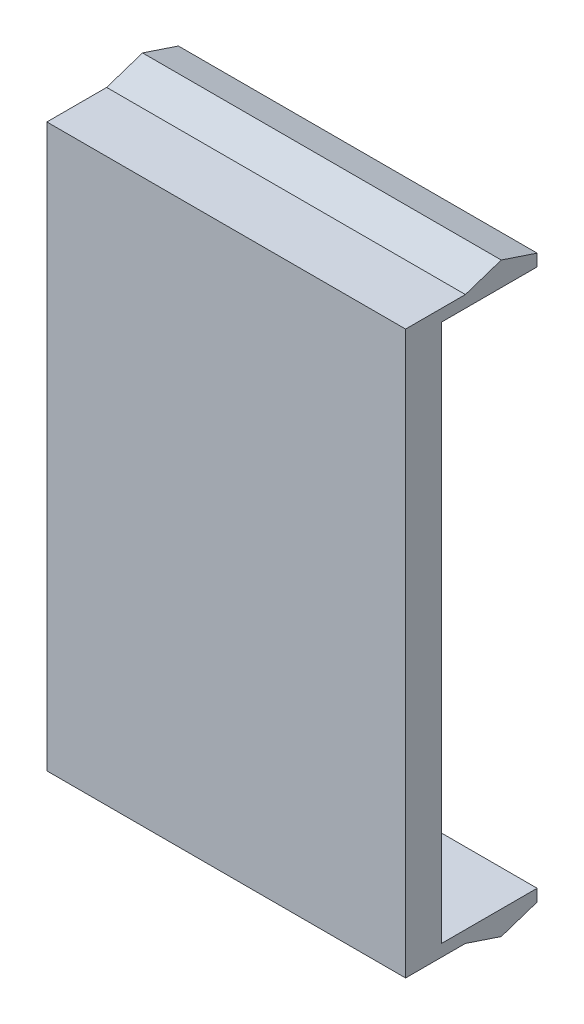
ISO-10303-21;
HEADER;
FILE_DESCRIPTION(('STEP AP214'),'2;1');
FILE_NAME('part.step','',(''),(''),'','','');
FILE_SCHEMA(('AUTOMOTIVE_DESIGN { 1 0 10303 214 1 1 1 1 }'));
ENDSEC;
DATA;
#1=APPLICATION_CONTEXT('core data for automotive mechanical design processes');
#2=APPLICATION_PROTOCOL_DEFINITION('international standard','automotive_design',2000,#1);
#3=PRODUCT_CONTEXT('',#1,'mechanical');
#4=PRODUCT('Part','Part','',(#3));
#5=PRODUCT_RELATED_PRODUCT_CATEGORY('part','',(#4));
#6=PRODUCT_DEFINITION_FORMATION('','',#4);
#7=PRODUCT_DEFINITION_CONTEXT('part definition',#1,'design');
#8=PRODUCT_DEFINITION('design','',#6,#7);
#9=PRODUCT_DEFINITION_SHAPE('','',#8);
#10=(LENGTH_UNIT() NAMED_UNIT(*) SI_UNIT(.MILLI.,.METRE.));
#11=(NAMED_UNIT(*) PLANE_ANGLE_UNIT() SI_UNIT($,.RADIAN.));
#12=(NAMED_UNIT(*) SI_UNIT($,.STERADIAN.) SOLID_ANGLE_UNIT());
#13=UNCERTAINTY_MEASURE_WITH_UNIT(LENGTH_MEASURE(1.E-05),#10,'distance_accuracy_value','');
#14=(GEOMETRIC_REPRESENTATION_CONTEXT(3) GLOBAL_UNCERTAINTY_ASSIGNED_CONTEXT((#13)) GLOBAL_UNIT_ASSIGNED_CONTEXT((#10,
#11,#12)) REPRESENTATION_CONTEXT('',''));
#15=CARTESIAN_POINT('',(0.,0.,0.));
#16=DIRECTION('',(0.,0.,1.));
#17=DIRECTION('',(1.,0.,0.));
#18=AXIS2_PLACEMENT_3D('',#15,#16,#17);
#19=CARTESIAN_POINT('',(-15.,23.5,3.));
#20=DIRECTION('',(0.,-1.,0.));
#21=DIRECTION('',(0.,0.,-1.));
#22=AXIS2_PLACEMENT_3D('',#19,#20,#21);
#23=PLANE('',#22);
#24=DIRECTION('',(1.,0.,0.));
#25=VECTOR('',#24,1.);
#26=CARTESIAN_POINT('',(-15.,23.5,-2.00000000000003));
#27=LINE('',#26,#25);
#28=CARTESIAN_POINT('',(-15.,23.5,-2.00000000000003));
#29=VERTEX_POINT('',#28);
#30=CARTESIAN_POINT('',(15.,23.5,-2.00000000000003));
#31=VERTEX_POINT('',#30);
#32=EDGE_CURVE('E70',#29,#31,#27,.T.);
#33=ORIENTED_EDGE('',*,*,#32,.F.);
#34=DIRECTION('',(0.,0.,-1.));
#35=VECTOR('',#34,1.);
#36=CARTESIAN_POINT('',(-15.,23.5,3.));
#37=LINE('',#36,#35);
#38=CARTESIAN_POINT('',(-15.,23.5,3.));
#39=VERTEX_POINT('',#38);
#40=EDGE_CURVE('E56',#39,#29,#37,.T.);
#41=ORIENTED_EDGE('',*,*,#40,.F.);
#42=DIRECTION('',(-1.,0.,0.));
#43=VECTOR('',#42,1.);
#44=CARTESIAN_POINT('',(-15.,23.5,3.));
#45=LINE('',#44,#43);
#46=CARTESIAN_POINT('',(15.,23.5,3.));
#47=VERTEX_POINT('',#46);
#48=EDGE_CURVE('E208',#47,#39,#45,.T.);
#49=ORIENTED_EDGE('',*,*,#48,.F.);
#50=DIRECTION('',(0.,0.,-1.));
#51=VECTOR('',#50,1.);
#52=CARTESIAN_POINT('',(15.,23.5,3.));
#53=LINE('',#52,#51);
#54=EDGE_CURVE('E11',#47,#31,#53,.T.);
#55=ORIENTED_EDGE('',*,*,#54,.T.);
#56=EDGE_LOOP('',(#33,#41,#49,#55));
#57=FACE_BOUND('',#56,.T.);
#58=ADVANCED_FACE('F47',(#57),#23,.F.);
#59=CARTESIAN_POINT('',(15.,-23.5,3.));
#60=DIRECTION('',(-1.,0.,0.));
#61=DIRECTION('',(0.,0.,1.));
#62=AXIS2_PLACEMENT_3D('',#59,#60,#61);
#63=PLANE('',#62);
#64=DIRECTION('',(0.,0.,-1.));
#65=VECTOR('',#64,1.);
#66=CARTESIAN_POINT('',(15.,-23.5,3.));
#67=LINE('',#66,#65);
#68=CARTESIAN_POINT('',(15.,-23.5,3.));
#69=VERTEX_POINT('',#68);
#70=CARTESIAN_POINT('',(15.,-23.5,-2.));
#71=VERTEX_POINT('',#70);
#72=EDGE_CURVE('E218',#69,#71,#67,.T.);
#73=ORIENTED_EDGE('',*,*,#72,.T.);
#74=DIRECTION('',(0.,0.31622776601684,0.948683298050513));
#75=VECTOR('',#74,1.);
#76=CARTESIAN_POINT('',(15.,-20.55,6.85000000000004));
#77=LINE('',#76,#75);
#78=CARTESIAN_POINT('',(15.,-24.5,-5.));
#79=VERTEX_POINT('',#78);
#80=EDGE_CURVE('E63',#79,#71,#77,.T.);
#81=ORIENTED_EDGE('',*,*,#80,.F.);
#82=DIRECTION('',(0.,-0.316227766016838,0.948683298050514));
#83=VECTOR('',#82,1.);
#84=CARTESIAN_POINT('',(15.,-23.55,-7.85));
#85=LINE('',#84,#83);
#86=CARTESIAN_POINT('',(15.,-23.5,-8.));
#87=VERTEX_POINT('',#86);
#88=EDGE_CURVE('E267',#87,#79,#85,.T.);
#89=ORIENTED_EDGE('',*,*,#88,.F.);
#90=DIRECTION('',(0.,-1.,0.));
#91=VECTOR('',#90,1.);
#92=CARTESIAN_POINT('',(15.,0.,-8.));
#93=LINE('',#92,#91);
#94=CARTESIAN_POINT('',(15.,-22.5,-8.));
#95=VERTEX_POINT('',#94);
#96=EDGE_CURVE('E157',#95,#87,#93,.T.);
#97=ORIENTED_EDGE('',*,*,#96,.F.);
#98=DIRECTION('',(0.,0.,1.));
#99=VECTOR('',#98,1.);
#100=CARTESIAN_POINT('',(15.,-22.5,-8.));
#101=LINE('',#100,#99);
#102=CARTESIAN_POINT('',(15.,-22.5,0.));
#103=VERTEX_POINT('',#102);
#104=EDGE_CURVE('E167',#95,#103,#101,.T.);
#105=ORIENTED_EDGE('',*,*,#104,.T.);
#106=DIRECTION('',(0.,1.,0.));
#107=VECTOR('',#106,1.);
#108=CARTESIAN_POINT('',(15.,-23.5,0.));
#109=LINE('',#108,#107);
#110=CARTESIAN_POINT('',(15.,22.5,0.));
#111=VERTEX_POINT('',#110);
#112=EDGE_CURVE('E203',#103,#111,#109,.T.);
#113=ORIENTED_EDGE('',*,*,#112,.T.);
#114=DIRECTION('',(0.,0.,1.));
#115=VECTOR('',#114,1.);
#116=CARTESIAN_POINT('',(15.,22.5,-8.));
#117=LINE('',#116,#115);
#118=CARTESIAN_POINT('',(15.,22.5,-8.));
#119=VERTEX_POINT('',#118);
#120=EDGE_CURVE('E199',#119,#111,#117,.T.);
#121=ORIENTED_EDGE('',*,*,#120,.F.);
#122=DIRECTION('',(0.,-1.,0.));
#123=VECTOR('',#122,1.);
#124=CARTESIAN_POINT('',(15.,0.,-8.));
#125=LINE('',#124,#123);
#126=CARTESIAN_POINT('',(15.,23.5,-8.));
#127=VERTEX_POINT('',#126);
#128=EDGE_CURVE('E179',#127,#119,#125,.T.);
#129=ORIENTED_EDGE('',*,*,#128,.F.);
#130=DIRECTION('',(0.,0.316227766016838,0.948683298050514));
#131=VECTOR('',#130,1.);
#132=CARTESIAN_POINT('',(15.,23.55,-7.85));
#133=LINE('',#132,#131);
#134=CARTESIAN_POINT('',(15.,24.5,-5.));
#135=VERTEX_POINT('',#134);
#136=EDGE_CURVE('E252',#127,#135,#133,.T.);
#137=ORIENTED_EDGE('',*,*,#136,.T.);
#138=DIRECTION('',(0.,-0.31622776601684,0.948683298050513));
#139=VECTOR('',#138,1.);
#140=CARTESIAN_POINT('',(15.,20.55,6.85000000000004));
#141=LINE('',#140,#139);
#142=EDGE_CURVE('E248',#135,#31,#141,.T.);
#143=ORIENTED_EDGE('',*,*,#142,.T.);
#144=ORIENTED_EDGE('',*,*,#54,.F.);
#145=DIRECTION('',(0.,1.,0.));
#146=VECTOR('',#145,1.);
#147=CARTESIAN_POINT('',(15.,-23.5,3.));
#148=LINE('',#147,#146);
#149=EDGE_CURVE('E204',#69,#47,#148,.T.);
#150=ORIENTED_EDGE('',*,*,#149,.F.);
#151=EDGE_LOOP('',(#73,#81,#89,#97,#105,#113,#121,#129,#137,#143,#144,#150));
#152=FACE_BOUND('',#151,.T.);
#153=ADVANCED_FACE('F49',(#152),#63,.F.);
#154=CARTESIAN_POINT('',(-15.,-23.5,3.));
#155=DIRECTION('',(1.,0.,0.));
#156=DIRECTION('',(0.,0.,-1.));
#157=AXIS2_PLACEMENT_3D('',#154,#155,#156);
#158=PLANE('',#157);
#159=ORIENTED_EDGE('',*,*,#40,.T.);
#160=DIRECTION('',(0.,-0.31622776601684,0.948683298050513));
#161=VECTOR('',#160,1.);
#162=CARTESIAN_POINT('',(-15.,20.55,6.85000000000004));
#163=LINE('',#162,#161);
#164=CARTESIAN_POINT('',(-15.,24.5,-5.));
#165=VERTEX_POINT('',#164);
#166=EDGE_CURVE('E234',#165,#29,#163,.T.);
#167=ORIENTED_EDGE('',*,*,#166,.F.);
#168=DIRECTION('',(0.,0.316227766016838,0.948683298050514));
#169=VECTOR('',#168,1.);
#170=CARTESIAN_POINT('',(-15.,23.55,-7.85));
#171=LINE('',#170,#169);
#172=CARTESIAN_POINT('',(-15.,23.5,-8.));
#173=VERTEX_POINT('',#172);
#174=EDGE_CURVE('E243',#173,#165,#171,.T.);
#175=ORIENTED_EDGE('',*,*,#174,.F.);
#176=DIRECTION('',(0.,1.,0.));
#177=VECTOR('',#176,1.);
#178=CARTESIAN_POINT('',(-15.,0.,-8.));
#179=LINE('',#178,#177);
#180=CARTESIAN_POINT('',(-15.,22.5,-8.));
#181=VERTEX_POINT('',#180);
#182=EDGE_CURVE('E186',#181,#173,#179,.T.);
#183=ORIENTED_EDGE('',*,*,#182,.F.);
#184=DIRECTION('',(0.,0.,1.));
#185=VECTOR('',#184,1.);
#186=CARTESIAN_POINT('',(-15.,22.5,-8.));
#187=LINE('',#186,#185);
#188=CARTESIAN_POINT('',(-15.,22.5,0.));
#189=VERTEX_POINT('',#188);
#190=EDGE_CURVE('E192',#181,#189,#187,.T.);
#191=ORIENTED_EDGE('',*,*,#190,.T.);
#192=DIRECTION('',(0.,-1.,0.));
#193=VECTOR('',#192,1.);
#194=CARTESIAN_POINT('',(-15.,-23.5,0.));
#195=LINE('',#194,#193);
#196=CARTESIAN_POINT('',(-15.,-22.5,0.));
#197=VERTEX_POINT('',#196);
#198=EDGE_CURVE('E209',#189,#197,#195,.T.);
#199=ORIENTED_EDGE('',*,*,#198,.T.);
#200=DIRECTION('',(0.,0.,1.));
#201=VECTOR('',#200,1.);
#202=CARTESIAN_POINT('',(-15.,-22.5,-8.));
#203=LINE('',#202,#201);
#204=CARTESIAN_POINT('',(-15.,-22.5,-8.));
#205=VERTEX_POINT('',#204);
#206=EDGE_CURVE('E162',#205,#197,#203,.T.);
#207=ORIENTED_EDGE('',*,*,#206,.F.);
#208=DIRECTION('',(0.,1.,0.));
#209=VECTOR('',#208,1.);
#210=CARTESIAN_POINT('',(-15.,0.,-8.));
#211=LINE('',#210,#209);
#212=CARTESIAN_POINT('',(-15.,-23.5,-8.));
#213=VERTEX_POINT('',#212);
#214=EDGE_CURVE('E154',#213,#205,#211,.T.);
#215=ORIENTED_EDGE('',*,*,#214,.F.);
#216=DIRECTION('',(0.,-0.316227766016838,0.948683298050514));
#217=VECTOR('',#216,1.);
#218=CARTESIAN_POINT('',(-15.,-23.55,-7.85));
#219=LINE('',#218,#217);
#220=CARTESIAN_POINT('',(-15.,-24.5,-5.));
#221=VERTEX_POINT('',#220);
#222=EDGE_CURVE('E138',#213,#221,#219,.T.);
#223=ORIENTED_EDGE('',*,*,#222,.T.);
#224=DIRECTION('',(0.,0.31622776601684,0.948683298050513));
#225=VECTOR('',#224,1.);
#226=CARTESIAN_POINT('',(-15.,-20.55,6.85000000000004));
#227=LINE('',#226,#225);
#228=CARTESIAN_POINT('',(-15.,-23.5,-2.));
#229=VERTEX_POINT('',#228);
#230=EDGE_CURVE('E148',#221,#229,#227,.T.);
#231=ORIENTED_EDGE('',*,*,#230,.T.);
#232=DIRECTION('',(0.,0.,-1.));
#233=VECTOR('',#232,1.);
#234=CARTESIAN_POINT('',(-15.,-23.5,3.));
#235=LINE('',#234,#233);
#236=CARTESIAN_POINT('',(-15.,-23.5,3.));
#237=VERTEX_POINT('',#236);
#238=EDGE_CURVE('E226',#237,#229,#235,.T.);
#239=ORIENTED_EDGE('',*,*,#238,.F.);
#240=DIRECTION('',(0.,-1.,0.));
#241=VECTOR('',#240,1.);
#242=CARTESIAN_POINT('',(-15.,-23.5,3.));
#243=LINE('',#242,#241);
#244=EDGE_CURVE('E212',#39,#237,#243,.T.);
#245=ORIENTED_EDGE('',*,*,#244,.F.);
#246=EDGE_LOOP('',(#159,#167,#175,#183,#191,#199,#207,#215,#223,#231,#239,#245));
#247=FACE_BOUND('',#246,.T.);
#248=ADVANCED_FACE('F160',(#247),#158,.F.);
#249=CARTESIAN_POINT('',(-15.,-23.5,3.));
#250=DIRECTION('',(0.,1.,0.));
#251=DIRECTION('',(0.,0.,1.));
#252=AXIS2_PLACEMENT_3D('',#249,#250,#251);
#253=PLANE('',#252);
#254=ORIENTED_EDGE('',*,*,#238,.T.);
#255=DIRECTION('',(1.,0.,0.));
#256=VECTOR('',#255,1.);
#257=CARTESIAN_POINT('',(-15.,-23.5,-2.));
#258=LINE('',#257,#256);
#259=EDGE_CURVE('E275',#229,#71,#258,.T.);
#260=ORIENTED_EDGE('',*,*,#259,.T.);
#261=ORIENTED_EDGE('',*,*,#72,.F.);
#262=DIRECTION('',(1.,0.,0.));
#263=VECTOR('',#262,1.);
#264=CARTESIAN_POINT('',(-15.,-23.5,3.));
#265=LINE('',#264,#263);
#266=EDGE_CURVE('E215',#237,#69,#265,.T.);
#267=ORIENTED_EDGE('',*,*,#266,.F.);
#268=EDGE_LOOP('',(#254,#260,#261,#267));
#269=FACE_BOUND('',#268,.T.);
#270=ADVANCED_FACE('F282',(#269),#253,.F.);
#271=CARTESIAN_POINT('',(0.,0.,3.));
#272=DIRECTION('',(0.,0.,-1.));
#273=DIRECTION('',(-1.,0.,0.));
#274=AXIS2_PLACEMENT_3D('',#271,#272,#273);
#275=PLANE('',#274);
#276=ORIENTED_EDGE('',*,*,#149,.T.);
#277=ORIENTED_EDGE('',*,*,#48,.T.);
#278=ORIENTED_EDGE('',*,*,#244,.T.);
#279=ORIENTED_EDGE('',*,*,#266,.T.);
#280=EDGE_LOOP('',(#276,#277,#278,#279));
#281=FACE_BOUND('',#280,.T.);
#282=ADVANCED_FACE('F285',(#281),#275,.F.);
#283=CARTESIAN_POINT('',(0.,0.,0.));
#284=DIRECTION('',(0.,0.,-1.));
#285=DIRECTION('',(-1.,0.,0.));
#286=AXIS2_PLACEMENT_3D('',#283,#284,#285);
#287=PLANE('',#286);
#288=DIRECTION('',(-1.,0.,0.));
#289=VECTOR('',#288,1.);
#290=CARTESIAN_POINT('',(0.,-22.5,0.));
#291=LINE('',#290,#289);
#292=EDGE_CURVE('E171',#103,#197,#291,.T.);
#293=ORIENTED_EDGE('',*,*,#292,.T.);
#294=ORIENTED_EDGE('',*,*,#198,.F.);
#295=DIRECTION('',(-1.,0.,0.));
#296=VECTOR('',#295,1.);
#297=CARTESIAN_POINT('',(0.,22.5,0.));
#298=LINE('',#297,#296);
#299=EDGE_CURVE('E178',#111,#189,#298,.T.);
#300=ORIENTED_EDGE('',*,*,#299,.F.);
#301=ORIENTED_EDGE('',*,*,#112,.F.);
#302=EDGE_LOOP('',(#293,#294,#300,#301));
#303=FACE_BOUND('',#302,.T.);
#304=ADVANCED_FACE('F301',(#303),#287,.T.);
#305=CARTESIAN_POINT('',(0.,22.5,-8.));
#306=DIRECTION('',(0.,1.,0.));
#307=DIRECTION('',(-1.,0.,0.));
#308=AXIS2_PLACEMENT_3D('',#305,#306,#307);
#309=PLANE('',#308);
#310=ORIENTED_EDGE('',*,*,#299,.T.);
#311=ORIENTED_EDGE('',*,*,#190,.F.);
#312=DIRECTION('',(-1.,0.,0.));
#313=VECTOR('',#312,1.);
#314=CARTESIAN_POINT('',(0.,22.5,-8.));
#315=LINE('',#314,#313);
#316=EDGE_CURVE('E183',#119,#181,#315,.T.);
#317=ORIENTED_EDGE('',*,*,#316,.F.);
#318=ORIENTED_EDGE('',*,*,#120,.T.);
#319=EDGE_LOOP('',(#310,#311,#317,#318));
#320=FACE_BOUND('',#319,.T.);
#321=ADVANCED_FACE('F298',(#320),#309,.F.);
#322=CARTESIAN_POINT('',(0.,0.,-8.));
#323=DIRECTION('',(0.,0.,-1.));
#324=DIRECTION('',(-1.,0.,0.));
#325=AXIS2_PLACEMENT_3D('',#322,#323,#324);
#326=PLANE('',#325);
#327=ORIENTED_EDGE('',*,*,#128,.T.);
#328=ORIENTED_EDGE('',*,*,#316,.T.);
#329=ORIENTED_EDGE('',*,*,#182,.T.);
#330=DIRECTION('',(1.,0.,0.));
#331=VECTOR('',#330,1.);
#332=CARTESIAN_POINT('',(0.,23.5,-8.));
#333=LINE('',#332,#331);
#334=EDGE_CURVE('E189',#173,#127,#333,.T.);
#335=ORIENTED_EDGE('',*,*,#334,.T.);
#336=EDGE_LOOP('',(#327,#328,#329,#335));
#337=FACE_BOUND('',#336,.T.);
#338=ADVANCED_FACE('F296',(#337),#326,.T.);
#339=CARTESIAN_POINT('',(0.,-22.5,-8.));
#340=DIRECTION('',(0.,1.,0.));
#341=DIRECTION('',(-1.,0.,0.));
#342=AXIS2_PLACEMENT_3D('',#339,#340,#341);
#343=PLANE('',#342);
#344=ORIENTED_EDGE('',*,*,#292,.F.);
#345=ORIENTED_EDGE('',*,*,#104,.F.);
#346=DIRECTION('',(-1.,0.,0.));
#347=VECTOR('',#346,1.);
#348=CARTESIAN_POINT('',(0.,-22.5,-8.));
#349=LINE('',#348,#347);
#350=EDGE_CURVE('E174',#95,#205,#349,.T.);
#351=ORIENTED_EDGE('',*,*,#350,.T.);
#352=ORIENTED_EDGE('',*,*,#206,.T.);
#353=EDGE_LOOP('',(#344,#345,#351,#352));
#354=FACE_BOUND('',#353,.T.);
#355=ADVANCED_FACE('F264',(#354),#343,.T.);
#356=CARTESIAN_POINT('',(0.,0.,-8.));
#357=DIRECTION('',(0.,0.,-1.));
#358=DIRECTION('',(-1.,0.,0.));
#359=AXIS2_PLACEMENT_3D('',#356,#357,#358);
#360=PLANE('',#359);
#361=ORIENTED_EDGE('',*,*,#350,.F.);
#362=ORIENTED_EDGE('',*,*,#96,.T.);
#363=DIRECTION('',(-1.,0.,0.));
#364=VECTOR('',#363,1.);
#365=CARTESIAN_POINT('',(0.,-23.5,-8.));
#366=LINE('',#365,#364);
#367=EDGE_CURVE('E142',#87,#213,#366,.T.);
#368=ORIENTED_EDGE('',*,*,#367,.T.);
#369=ORIENTED_EDGE('',*,*,#214,.T.);
#370=EDGE_LOOP('',(#361,#362,#368,#369));
#371=FACE_BOUND('',#370,.T.);
#372=ADVANCED_FACE('F153',(#371),#360,.T.);
#373=CARTESIAN_POINT('',(-15.,23.55,-7.85));
#374=DIRECTION('',(0.,0.948683298050514,-0.316227766016838));
#375=DIRECTION('',(0.,0.316227766016838,0.948683298050514));
#376=AXIS2_PLACEMENT_3D('',#373,#374,#375);
#377=PLANE('',#376);
#378=ORIENTED_EDGE('',*,*,#136,.F.);
#379=ORIENTED_EDGE('',*,*,#334,.F.);
#380=ORIENTED_EDGE('',*,*,#174,.T.);
#381=DIRECTION('',(1.,0.,0.));
#382=VECTOR('',#381,1.);
#383=CARTESIAN_POINT('',(-15.,24.5,-5.));
#384=LINE('',#383,#382);
#385=EDGE_CURVE('E241',#165,#135,#384,.T.);
#386=ORIENTED_EDGE('',*,*,#385,.T.);
#387=EDGE_LOOP('',(#378,#379,#380,#386));
#388=FACE_BOUND('',#387,.T.);
#389=ADVANCED_FACE('F292',(#388),#377,.T.);
#390=CARTESIAN_POINT('',(-15.,20.55,6.85000000000004));
#391=DIRECTION('',(0.,0.948683298050513,0.31622776601684));
#392=DIRECTION('',(0.,-0.31622776601684,0.948683298050513));
#393=AXIS2_PLACEMENT_3D('',#390,#391,#392);
#394=PLANE('',#393);
#395=ORIENTED_EDGE('',*,*,#142,.F.);
#396=ORIENTED_EDGE('',*,*,#385,.F.);
#397=ORIENTED_EDGE('',*,*,#166,.T.);
#398=ORIENTED_EDGE('',*,*,#32,.T.);
#399=EDGE_LOOP('',(#395,#396,#397,#398));
#400=FACE_BOUND('',#399,.T.);
#401=ADVANCED_FACE('F239',(#400),#394,.T.);
#402=CARTESIAN_POINT('',(-15.,-23.55,-7.85));
#403=DIRECTION('',(0.,0.948683298050514,0.316227766016838));
#404=DIRECTION('',(0.,-0.316227766016838,0.948683298050514));
#405=AXIS2_PLACEMENT_3D('',#402,#403,#404);
#406=PLANE('',#405);
#407=ORIENTED_EDGE('',*,*,#88,.T.);
#408=DIRECTION('',(1.,0.,0.));
#409=VECTOR('',#408,1.);
#410=CARTESIAN_POINT('',(-15.,-24.5,-5.));
#411=LINE('',#410,#409);
#412=EDGE_CURVE('E144',#221,#79,#411,.T.);
#413=ORIENTED_EDGE('',*,*,#412,.F.);
#414=ORIENTED_EDGE('',*,*,#222,.F.);
#415=ORIENTED_EDGE('',*,*,#367,.F.);
#416=EDGE_LOOP('',(#407,#413,#414,#415));
#417=FACE_BOUND('',#416,.T.);
#418=ADVANCED_FACE('F141',(#417),#406,.F.);
#419=CARTESIAN_POINT('',(-15.,-20.55,6.85000000000004));
#420=DIRECTION('',(0.,0.948683298050513,-0.31622776601684));
#421=DIRECTION('',(0.,0.31622776601684,0.948683298050513));
#422=AXIS2_PLACEMENT_3D('',#419,#420,#421);
#423=PLANE('',#422);
#424=ORIENTED_EDGE('',*,*,#80,.T.);
#425=ORIENTED_EDGE('',*,*,#259,.F.);
#426=ORIENTED_EDGE('',*,*,#230,.F.);
#427=ORIENTED_EDGE('',*,*,#412,.T.);
#428=EDGE_LOOP('',(#424,#425,#426,#427));
#429=FACE_BOUND('',#428,.T.);
#430=ADVANCED_FACE('F281',(#429),#423,.F.);
#431=CLOSED_SHELL('',(#58,#153,#248,#270,#282,#304,#321,#338,#355,#372,#389,#401,#418,#430));
#432=MANIFOLD_SOLID_BREP('B2',#431);
#433=ADVANCED_BREP_SHAPE_REPRESENTATION('',(#18,#432),#14);
#434=SHAPE_DEFINITION_REPRESENTATION(#9,#433);
ENDSEC;
END-ISO-10303-21;
